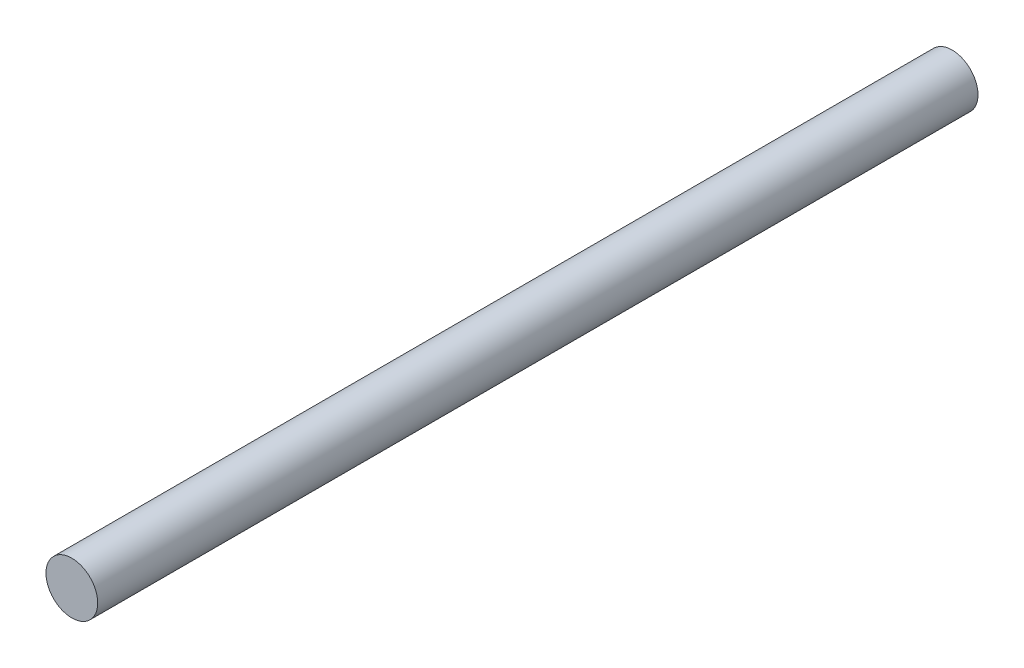
ISO-10303-21;
HEADER;
FILE_DESCRIPTION(('STEP AP214'),'2;1');
FILE_NAME('part.step','',(''),(''),'','','');
FILE_SCHEMA(('AUTOMOTIVE_DESIGN { 1 0 10303 214 1 1 1 1 }'));
ENDSEC;
DATA;
#1=APPLICATION_CONTEXT('core data for automotive mechanical design processes');
#2=APPLICATION_PROTOCOL_DEFINITION('international standard','automotive_design',2000,#1);
#3=PRODUCT_CONTEXT('',#1,'mechanical');
#4=PRODUCT('Part','Part','',(#3));
#5=PRODUCT_RELATED_PRODUCT_CATEGORY('part','',(#4));
#6=PRODUCT_DEFINITION_FORMATION('','',#4);
#7=PRODUCT_DEFINITION_CONTEXT('part definition',#1,'design');
#8=PRODUCT_DEFINITION('design','',#6,#7);
#9=PRODUCT_DEFINITION_SHAPE('','',#8);
#10=(LENGTH_UNIT() NAMED_UNIT(*) SI_UNIT(.MILLI.,.METRE.));
#11=(NAMED_UNIT(*) PLANE_ANGLE_UNIT() SI_UNIT($,.RADIAN.));
#12=(NAMED_UNIT(*) SI_UNIT($,.STERADIAN.) SOLID_ANGLE_UNIT());
#13=UNCERTAINTY_MEASURE_WITH_UNIT(LENGTH_MEASURE(1.E-05),#10,'distance_accuracy_value','');
#14=(GEOMETRIC_REPRESENTATION_CONTEXT(3) GLOBAL_UNCERTAINTY_ASSIGNED_CONTEXT((#13)) GLOBAL_UNIT_ASSIGNED_CONTEXT((#10,
#11,#12)) REPRESENTATION_CONTEXT('',''));
#15=CARTESIAN_POINT('',(0.,0.,0.));
#16=DIRECTION('',(0.,0.,1.));
#17=DIRECTION('',(1.,0.,0.));
#18=AXIS2_PLACEMENT_3D('',#15,#16,#17);
#19=CARTESIAN_POINT('',(0.,0.,53.975));
#20=DIRECTION('',(0.,0.,-1.));
#21=DIRECTION('',(-1.,0.,0.));
#22=AXIS2_PLACEMENT_3D('',#19,#20,#21);
#23=CYLINDRICAL_SURFACE('',#22,1.5875);
#24=CARTESIAN_POINT('',(0.,0.,53.975));
#25=DIRECTION('',(0.,0.,1.));
#26=DIRECTION('',(1.,0.,0.));
#27=AXIS2_PLACEMENT_3D('',#24,#25,#26);
#28=CIRCLE('',#27,1.5875);
#29=CARTESIAN_POINT('',(1.5875,0.,53.975));
#30=VERTEX_POINT('',#29);
#31=EDGE_CURVE('E10',#30,#30,#28,.T.);
#32=ORIENTED_EDGE('',*,*,#31,.F.);
#33=EDGE_LOOP('',(#32));
#34=FACE_BOUND('',#33,.T.);
#35=CARTESIAN_POINT('',(0.,0.,0.));
#36=DIRECTION('',(0.,0.,1.));
#37=DIRECTION('',(1.,0.,0.));
#38=AXIS2_PLACEMENT_3D('',#35,#36,#37);
#39=CIRCLE('',#38,1.5875);
#40=CARTESIAN_POINT('',(1.5875,0.,0.));
#41=VERTEX_POINT('',#40);
#42=EDGE_CURVE('E40',#41,#41,#39,.T.);
#43=ORIENTED_EDGE('',*,*,#42,.T.);
#44=EDGE_LOOP('',(#43));
#45=FACE_BOUND('',#44,.T.);
#46=ADVANCED_FACE('F37',(#34,#45),#23,.T.);
#47=CARTESIAN_POINT('',(0.,0.,53.975));
#48=DIRECTION('',(0.,0.,1.));
#49=DIRECTION('',(1.,0.,0.));
#50=AXIS2_PLACEMENT_3D('',#47,#48,#49);
#51=PLANE('',#50);
#52=ORIENTED_EDGE('',*,*,#31,.T.);
#53=EDGE_LOOP('',(#52));
#54=FACE_BOUND('',#53,.T.);
#55=ADVANCED_FACE('F54',(#54),#51,.T.);
#56=CARTESIAN_POINT('',(0.,0.,0.));
#57=DIRECTION('',(0.,0.,1.));
#58=DIRECTION('',(1.,0.,0.));
#59=AXIS2_PLACEMENT_3D('',#56,#57,#58);
#60=PLANE('',#59);
#61=ORIENTED_EDGE('',*,*,#42,.F.);
#62=EDGE_LOOP('',(#61));
#63=FACE_BOUND('',#62,.T.);
#64=ADVANCED_FACE('F52',(#63),#60,.F.);
#65=CLOSED_SHELL('',(#46,#55,#64));
#66=MANIFOLD_SOLID_BREP('B2',#65);
#67=ADVANCED_BREP_SHAPE_REPRESENTATION('',(#18,#66),#14);
#68=SHAPE_DEFINITION_REPRESENTATION(#9,#67);
ENDSEC;
END-ISO-10303-21;
